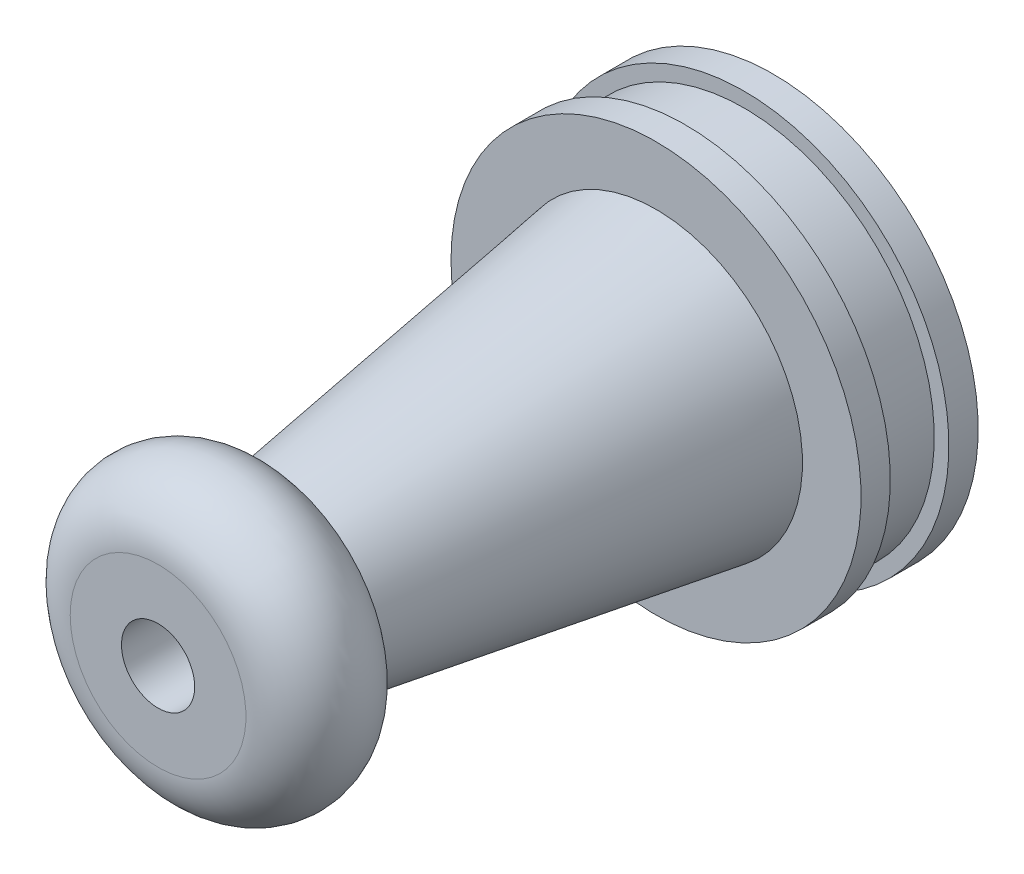
ISO-10303-21;
HEADER;
FILE_DESCRIPTION(('STEP AP214'),'2;1');
FILE_NAME('part.step','',(''),(''),'','','');
FILE_SCHEMA(('AUTOMOTIVE_DESIGN { 1 0 10303 214 1 1 1 1 }'));
ENDSEC;
DATA;
#1=APPLICATION_CONTEXT('core data for automotive mechanical design processes');
#2=APPLICATION_PROTOCOL_DEFINITION('international standard','automotive_design',2000,#1);
#3=PRODUCT_CONTEXT('',#1,'mechanical');
#4=PRODUCT('Part','Part','',(#3));
#5=PRODUCT_RELATED_PRODUCT_CATEGORY('part','',(#4));
#6=PRODUCT_DEFINITION_FORMATION('','',#4);
#7=PRODUCT_DEFINITION_CONTEXT('part definition',#1,'design');
#8=PRODUCT_DEFINITION('design','',#6,#7);
#9=PRODUCT_DEFINITION_SHAPE('','',#8);
#10=(LENGTH_UNIT() NAMED_UNIT(*) SI_UNIT(.MILLI.,.METRE.));
#11=(NAMED_UNIT(*) PLANE_ANGLE_UNIT() SI_UNIT($,.RADIAN.));
#12=(NAMED_UNIT(*) SI_UNIT($,.STERADIAN.) SOLID_ANGLE_UNIT());
#13=UNCERTAINTY_MEASURE_WITH_UNIT(LENGTH_MEASURE(1.E-05),#10,'distance_accuracy_value','');
#14=(GEOMETRIC_REPRESENTATION_CONTEXT(3) GLOBAL_UNCERTAINTY_ASSIGNED_CONTEXT((#13)) GLOBAL_UNIT_ASSIGNED_CONTEXT((#10,
#11,#12)) REPRESENTATION_CONTEXT('',''));
#15=CARTESIAN_POINT('',(0.,0.,0.));
#16=DIRECTION('',(0.,0.,1.));
#17=DIRECTION('',(1.,0.,0.));
#18=AXIS2_PLACEMENT_3D('',#15,#16,#17);
#19=CARTESIAN_POINT('',(0.,0.,-96.52));
#20=DIRECTION('',(0.,0.,1.));
#21=DIRECTION('',(1.,0.,0.));
#22=AXIS2_PLACEMENT_3D('',#19,#20,#21);
#23=CYLINDRICAL_SURFACE('',#22,35.56);
#24=CARTESIAN_POINT('',(0.,0.,-76.2));
#25=DIRECTION('',(0.,0.,-1.));
#26=DIRECTION('',(-1.,0.,0.));
#27=AXIS2_PLACEMENT_3D('',#24,#25,#26);
#28=CIRCLE('',#27,35.56);
#29=CARTESIAN_POINT('',(-35.56,0.,-76.2));
#30=VERTEX_POINT('',#29);
#31=EDGE_CURVE('E126',#30,#30,#28,.T.);
#32=ORIENTED_EDGE('',*,*,#31,.T.);
#33=EDGE_LOOP('',(#32));
#34=FACE_BOUND('',#33,.T.);
#35=CARTESIAN_POINT('',(0.,0.,-81.28));
#36=DIRECTION('',(0.,0.,-1.));
#37=DIRECTION('',(-1.,0.,0.));
#38=AXIS2_PLACEMENT_3D('',#35,#36,#37);
#39=CIRCLE('',#38,35.56);
#40=CARTESIAN_POINT('',(-35.56,0.,-81.28));
#41=VERTEX_POINT('',#40);
#42=EDGE_CURVE('E129',#41,#41,#39,.T.);
#43=ORIENTED_EDGE('',*,*,#42,.F.);
#44=EDGE_LOOP('',(#43));
#45=FACE_BOUND('',#44,.T.);
#46=ADVANCED_FACE('F51',(#34,#45),#23,.T.);
#47=CARTESIAN_POINT('',(0.,0.,10.16));
#48=DIRECTION('',(0.,0.,-1.));
#49=DIRECTION('',(-1.,0.,0.));
#50=AXIS2_PLACEMENT_3D('',#47,#48,#49);
#51=PLANE('',#50);
#52=CARTESIAN_POINT('',(0.,0.,10.16));
#53=DIRECTION('',(0.,0.,1.));
#54=DIRECTION('',(1.,0.,0.));
#55=AXIS2_PLACEMENT_3D('',#52,#53,#54);
#56=CIRCLE('',#55,6.35);
#57=CARTESIAN_POINT('',(6.35,0.,10.16));
#58=VERTEX_POINT('',#57);
#59=EDGE_CURVE('E150',#58,#58,#56,.T.);
#60=ORIENTED_EDGE('',*,*,#59,.F.);
#61=EDGE_LOOP('',(#60));
#62=FACE_BOUND('',#61,.T.);
#63=CARTESIAN_POINT('',(0.,0.,10.1600000000001));
#64=DIRECTION('',(0.,0.,-1.));
#65=DIRECTION('',(-1.,0.,0.));
#66=AXIS2_PLACEMENT_3D('',#63,#64,#65);
#67=CIRCLE('',#66,15.24);
#68=CARTESIAN_POINT('',(-15.2399999999999,0.,10.1600000000001));
#69=VERTEX_POINT('',#68);
#70=EDGE_CURVE('E60',#69,#69,#67,.T.);
#71=ORIENTED_EDGE('',*,*,#70,.F.);
#72=EDGE_LOOP('',(#71));
#73=FACE_BOUND('',#72,.T.);
#74=ADVANCED_FACE('F53',(#62,#73),#51,.F.);
#75=CARTESIAN_POINT('',(0.,0.,0.));
#76=DIRECTION('',(0.,0.,-1.));
#77=DIRECTION('',(-1.,0.,0.));
#78=AXIS2_PLACEMENT_3D('',#75,#76,#77);
#79=TOROIDAL_SURFACE('',#78,15.24,10.16);
#80=CARTESIAN_POINT('',(0.,0.,-10.16));
#81=DIRECTION('',(0.,0.,-1.));
#82=DIRECTION('',(-1.,0.,0.));
#83=AXIS2_PLACEMENT_3D('',#80,#81,#82);
#84=CIRCLE('',#83,15.24);
#85=CARTESIAN_POINT('',(-15.2400000000001,0.,-10.1599999999999));
#86=VERTEX_POINT('',#85);
#87=EDGE_CURVE('E11',#86,#86,#84,.T.);
#88=ORIENTED_EDGE('',*,*,#87,.F.);
#89=EDGE_LOOP('',(#88));
#90=FACE_BOUND('',#89,.T.);
#91=ORIENTED_EDGE('',*,*,#70,.T.);
#92=EDGE_LOOP('',(#91));
#93=FACE_BOUND('',#92,.T.);
#94=ADVANCED_FACE('F110',(#90,#93),#79,.T.);
#95=CARTESIAN_POINT('',(0.,0.,-10.16));
#96=DIRECTION('',(0.,0.,-1.));
#97=DIRECTION('',(-1.,0.,0.));
#98=AXIS2_PLACEMENT_3D('',#95,#96,#97);
#99=CONICAL_SURFACE('',#98,15.24,0.152649328395265);
#100=ORIENTED_EDGE('',*,*,#87,.T.);
#101=EDGE_LOOP('',(#100));
#102=FACE_BOUND('',#101,.T.);
#103=CARTESIAN_POINT('',(-2.96236303543775E-13,0.,-76.2));
#104=DIRECTION('',(0.,0.,-1.));
#105=DIRECTION('',(-1.,0.,0.));
#106=AXIS2_PLACEMENT_3D('',#103,#104,#105);
#107=CIRCLE('',#106,25.4);
#108=CARTESIAN_POINT('',(-25.4000000000003,0.,-76.1999999999999));
#109=VERTEX_POINT('',#108);
#110=EDGE_CURVE('E66',#109,#109,#107,.T.);
#111=ORIENTED_EDGE('',*,*,#110,.F.);
#112=EDGE_LOOP('',(#111));
#113=FACE_BOUND('',#112,.T.);
#114=ADVANCED_FACE('F103',(#102,#113),#99,.T.);
#115=CARTESIAN_POINT('',(0.,0.,-76.2));
#116=DIRECTION('',(0.,0.,-1.));
#117=DIRECTION('',(-1.,0.,0.));
#118=AXIS2_PLACEMENT_3D('',#115,#116,#117);
#119=PLANE('',#118);
#120=ORIENTED_EDGE('',*,*,#31,.F.);
#121=EDGE_LOOP('',(#120));
#122=FACE_BOUND('',#121,.T.);
#123=ORIENTED_EDGE('',*,*,#110,.T.);
#124=EDGE_LOOP('',(#123));
#125=FACE_BOUND('',#124,.T.);
#126=ADVANCED_FACE('F99',(#122,#125),#119,.F.);
#127=CARTESIAN_POINT('',(0.,0.,-81.28));
#128=DIRECTION('',(0.,0.,-1.));
#129=DIRECTION('',(-1.,0.,0.));
#130=AXIS2_PLACEMENT_3D('',#127,#128,#129);
#131=PLANE('',#130);
#132=CARTESIAN_POINT('',(0.,0.,-81.28));
#133=DIRECTION('',(0.,0.,-1.));
#134=DIRECTION('',(-1.,0.,0.));
#135=AXIS2_PLACEMENT_3D('',#132,#133,#134);
#136=CIRCLE('',#135,33.02);
#137=CARTESIAN_POINT('',(-33.02,0.,-81.28));
#138=VERTEX_POINT('',#137);
#139=EDGE_CURVE('E137',#138,#138,#136,.T.);
#140=ORIENTED_EDGE('',*,*,#139,.F.);
#141=EDGE_LOOP('',(#140));
#142=FACE_BOUND('',#141,.T.);
#143=ORIENTED_EDGE('',*,*,#42,.T.);
#144=EDGE_LOOP('',(#143));
#145=FACE_BOUND('',#144,.T.);
#146=ADVANCED_FACE('F102',(#142,#145),#131,.T.);
#147=CARTESIAN_POINT('',(0.,0.,-91.44));
#148=DIRECTION('',(0.,0.,-1.));
#149=DIRECTION('',(-1.,0.,0.));
#150=AXIS2_PLACEMENT_3D('',#147,#148,#149);
#151=PLANE('',#150);
#152=CARTESIAN_POINT('',(0.,0.,-91.44));
#153=DIRECTION('',(0.,0.,-1.));
#154=DIRECTION('',(-1.,0.,0.));
#155=AXIS2_PLACEMENT_3D('',#152,#153,#154);
#156=CIRCLE('',#155,33.02);
#157=CARTESIAN_POINT('',(-33.02,0.,-91.44));
#158=VERTEX_POINT('',#157);
#159=EDGE_CURVE('E140',#158,#158,#156,.T.);
#160=ORIENTED_EDGE('',*,*,#159,.T.);
#161=EDGE_LOOP('',(#160));
#162=FACE_BOUND('',#161,.T.);
#163=CARTESIAN_POINT('',(0.,0.,-91.44));
#164=DIRECTION('',(0.,0.,-1.));
#165=DIRECTION('',(-1.,0.,0.));
#166=AXIS2_PLACEMENT_3D('',#163,#164,#165);
#167=CIRCLE('',#166,35.56);
#168=CARTESIAN_POINT('',(-35.56,0.,-91.44));
#169=VERTEX_POINT('',#168);
#170=EDGE_CURVE('E132',#169,#169,#167,.T.);
#171=ORIENTED_EDGE('',*,*,#170,.F.);
#172=EDGE_LOOP('',(#171));
#173=FACE_BOUND('',#172,.T.);
#174=ADVANCED_FACE('F97',(#162,#173),#151,.F.);
#175=CARTESIAN_POINT('',(0.,0.,-81.28));
#176=DIRECTION('',(0.,0.,-1.));
#177=DIRECTION('',(-1.,0.,0.));
#178=AXIS2_PLACEMENT_3D('',#175,#176,#177);
#179=CYLINDRICAL_SURFACE('',#178,33.02);
#180=ORIENTED_EDGE('',*,*,#139,.T.);
#181=EDGE_LOOP('',(#180));
#182=FACE_BOUND('',#181,.T.);
#183=ORIENTED_EDGE('',*,*,#159,.F.);
#184=EDGE_LOOP('',(#183));
#185=FACE_BOUND('',#184,.T.);
#186=ADVANCED_FACE('F96',(#182,#185),#179,.T.);
#187=CARTESIAN_POINT('',(0.,0.,-96.52));
#188=DIRECTION('',(0.,0.,-1.));
#189=DIRECTION('',(-1.,0.,0.));
#190=AXIS2_PLACEMENT_3D('',#187,#188,#189);
#191=PLANE('',#190);
#192=CARTESIAN_POINT('',(0.,0.,-96.52));
#193=DIRECTION('',(0.,0.,-1.));
#194=DIRECTION('',(-1.,0.,0.));
#195=AXIS2_PLACEMENT_3D('',#192,#193,#194);
#196=CIRCLE('',#195,25.4);
#197=CARTESIAN_POINT('',(19.6319341564865,16.1166733935815,-96.52));
#198=VERTEX_POINT('',#197);
#199=EDGE_CURVE('E81',#198,#198,#196,.T.);
#200=ORIENTED_EDGE('',*,*,#199,.F.);
#201=EDGE_LOOP('',(#200));
#202=FACE_BOUND('',#201,.T.);
#203=CARTESIAN_POINT('',(0.,0.,-96.52));
#204=DIRECTION('',(0.,0.,-1.));
#205=DIRECTION('',(-1.,0.,0.));
#206=AXIS2_PLACEMENT_3D('',#203,#204,#205);
#207=CIRCLE('',#206,35.56);
#208=CARTESIAN_POINT('',(-35.56,0.,-96.52));
#209=VERTEX_POINT('',#208);
#210=EDGE_CURVE('E75',#209,#209,#207,.T.);
#211=ORIENTED_EDGE('',*,*,#210,.T.);
#212=EDGE_LOOP('',(#211));
#213=FACE_BOUND('',#212,.T.);
#214=ADVANCED_FACE('F85',(#202,#213),#191,.T.);
#215=ORIENTED_EDGE('',*,*,#170,.T.);
#216=EDGE_LOOP('',(#215));
#217=FACE_BOUND('',#216,.T.);
#218=ORIENTED_EDGE('',*,*,#210,.F.);
#219=EDGE_LOOP('',(#218));
#220=FACE_BOUND('',#219,.T.);
#221=ADVANCED_FACE('F95',(#217,#220),#23,.T.);
#222=CARTESIAN_POINT('',(0.,0.,-96.52));
#223=DIRECTION('',(0.,0.,1.));
#224=DIRECTION('',(1.,0.,0.));
#225=AXIS2_PLACEMENT_3D('',#222,#223,#224);
#226=CYLINDRICAL_SURFACE('',#225,6.35);
#227=ORIENTED_EDGE('',*,*,#59,.T.);
#228=EDGE_LOOP('',(#227));
#229=FACE_BOUND('',#228,.T.);
#230=CARTESIAN_POINT('',(0.,0.,-85.0160226953648));
#231=DIRECTION('',(0.,0.,1.));
#232=DIRECTION('',(0.,-1.,0.));
#233=AXIS2_PLACEMENT_3D('',#230,#231,#232);
#234=CIRCLE('',#233,6.35);
#235=CARTESIAN_POINT('',(2.82115907961658,5.68889808728342,-85.0160226953648));
#236=VERTEX_POINT('',#235);
#237=EDGE_CURVE('E55',#236,#236,#234,.T.);
#238=ORIENTED_EDGE('',*,*,#237,.F.);
#239=EDGE_LOOP('',(#238));
#240=FACE_BOUND('',#239,.T.);
#241=ADVANCED_FACE('F107',(#229,#240),#226,.F.);
#242=CARTESIAN_POINT('',(19.6319341564865,16.1166733935815,-96.52));
#243=CARTESIAN_POINT('',(-6.35,0.,-78.74));
#244=CARTESIAN_POINT('',(-12.6014126306765,55.3805417065545,-96.52));
#245=CARTESIAN_POINT('',(-6.35,-12.7,-78.74));
#246=CARTESIAN_POINT('',(-51.8652809436495,23.1471949193915,-96.52));
#247=CARTESIAN_POINT('',(6.35,-12.7,-78.74));
#248=CARTESIAN_POINT('',(-19.6319341564865,-16.1166733935815,-96.52));
#249=CARTESIAN_POINT('',(6.35,0.,-78.74));
#250=CARTESIAN_POINT('',(12.6014126306765,-55.3805417065545,-96.52));
#251=CARTESIAN_POINT('',(6.35,12.7,-78.74));
#252=CARTESIAN_POINT('',(51.8652809436495,-23.1471949193915,-96.52));
#253=CARTESIAN_POINT('',(-6.35,12.7,-78.74));
#254=CARTESIAN_POINT('',(19.6319341564865,16.1166733935815,-96.52));
#255=CARTESIAN_POINT('',(-6.35,0.,-78.74));
#256=(BOUNDED_SURFACE() B_SPLINE_SURFACE(3,1,((#242,#243),(#244,#245),(#246,#247),(#248,#249),
(#250,#251),(#252,#253),(#254,#255)),.UNSPECIFIED.,.T.,.F.,.F.) B_SPLINE_SURFACE_WITH_KNOTS((4,
3,4),(2,2),(0.,0.5,1.),(0.,1.),
.UNSPECIFIED.) GEOMETRIC_REPRESENTATION_ITEM() RATIONAL_B_SPLINE_SURFACE(((1.,1.),
(0.333333333333333,0.333333333333333),(0.333333333333333,0.333333333333333),(1.,1.),
(0.333333333333334,0.333333333333333),(0.333333333333334,0.333333333333333),(1.,1.))) REPRESENTATION_ITEM('') SURFACE());
#257=CARTESIAN_POINT('',(2.82115907961658,5.68889808728342,-85.0160226953648));
#258=CARTESIAN_POINT('',(2.99627132000064,5.79752074672403,-85.135855792288));
#259=CARTESIAN_POINT('',(3.1713835603847,5.90614340616463,-85.2556888892113));
#260=CARTESIAN_POINT('',(3.52160804115282,6.12338872504584,-85.4953550830579));
#261=CARTESIAN_POINT('',(3.69672028153689,6.23201138448645,-85.6151881799812));
#262=CARTESIAN_POINT('',(4.04694476230501,6.44925670336765,-85.8548543738277));
#263=CARTESIAN_POINT('',(4.22205700268907,6.55787936280826,-85.974687470751));
#264=CARTESIAN_POINT('',(4.5722814834572,6.77512468168947,-86.2143536645976));
#265=CARTESIAN_POINT('',(4.74739372384126,6.88374734113008,-86.3341867615209));
#266=CARTESIAN_POINT('',(5.09761820460938,7.10099266001129,-86.5738529553674));
#267=CARTESIAN_POINT('',(5.27273044499344,7.20961531945189,-86.6936860522907));
#268=CARTESIAN_POINT('',(5.62295492576157,7.4268606383331,-86.9333522461373));
#269=CARTESIAN_POINT('',(5.79806716614563,7.53548329777371,-87.0531853430606));
#270=CARTESIAN_POINT('',(6.14829164691375,7.75272861665492,-87.2928515369071));
#271=CARTESIAN_POINT('',(6.32340388729781,7.86135127609552,-87.4126846338304));
#272=CARTESIAN_POINT('',(6.67362836806594,8.07859659497673,-87.652350827677));
#273=CARTESIAN_POINT('',(6.84874060845,8.18721925441734,-87.7721839246003));
#274=CARTESIAN_POINT('',(7.19896508921813,8.40446457329855,-88.0118501184468));
#275=CARTESIAN_POINT('',(7.37407732960219,8.51308723273915,-88.1316832153701));
#276=CARTESIAN_POINT('',(7.72430181037031,8.73033255162036,-88.3713494092167));
#277=CARTESIAN_POINT('',(7.89941405075437,8.83895521106097,-88.49118250614));
#278=CARTESIAN_POINT('',(8.2496385315225,9.05620052994218,-88.7308486999865));
#279=CARTESIAN_POINT('',(8.42475077190656,9.16482318938278,-88.8506817969098));
#280=CARTESIAN_POINT('',(8.77497525267468,9.38206850826399,-89.0903479907564));
#281=CARTESIAN_POINT('',(8.95008749305874,9.4906911677046,-89.2101810876797));
#282=CARTESIAN_POINT('',(9.30031197382687,9.70793648658581,-89.4498472815262));
#283=CARTESIAN_POINT('',(9.47542421421093,9.81655914602641,-89.5696803784495));
#284=CARTESIAN_POINT('',(9.82564869497905,10.0338044649076,-89.8093465722961));
#285=CARTESIAN_POINT('',(10.0007609353631,10.1424271243482,-89.9291796692194));
#286=CARTESIAN_POINT('',(10.3509854161312,10.3596724432294,-90.1688458630659));
#287=CARTESIAN_POINT('',(10.5260976565153,10.46829510267,-90.2886789599892));
#288=CARTESIAN_POINT('',(10.8763221372834,10.6855404215513,-90.5283451538358));
#289=CARTESIAN_POINT('',(11.0514343776675,10.7941630809919,-90.6481782507591));
#290=CARTESIAN_POINT('',(11.4016588584356,11.0114083998731,-90.8878444446056));
#291=CARTESIAN_POINT('',(11.5767710988197,11.1200310593137,-91.0076775415289));
#292=CARTESIAN_POINT('',(11.9269955795878,11.3372763781949,-91.2473437353755));
#293=CARTESIAN_POINT('',(12.1021078199719,11.4458990376355,-91.3671768322988));
#294=CARTESIAN_POINT('',(12.45233230074,11.6631443565167,-91.6068430261453));
#295=CARTESIAN_POINT('',(12.627444541124,11.7717670159573,-91.7266761230686));
#296=CARTESIAN_POINT('',(12.9776690218922,11.9890123348385,-91.9663423169152));
#297=CARTESIAN_POINT('',(13.1527812622762,12.0976349942791,-92.0861754138385));
#298=CARTESIAN_POINT('',(13.5030057430443,12.3148803131603,-92.3258416076851));
#299=CARTESIAN_POINT('',(13.6781179834284,12.4235029726009,-92.4456747046083));
#300=CARTESIAN_POINT('',(14.0283424641965,12.6407482914821,-92.6853408984549));
#301=CARTESIAN_POINT('',(14.2034547045806,12.7493709509227,-92.8051739953782));
#302=CARTESIAN_POINT('',(14.5536791853487,12.966616269804,-93.0448401892247));
#303=CARTESIAN_POINT('',(14.7287914257328,13.0752389292446,-93.164673286148));
#304=CARTESIAN_POINT('',(15.0790159065009,13.2924842481258,-93.4043394799946));
#305=CARTESIAN_POINT('',(15.254128146885,13.4011069075664,-93.5241725769179));
#306=CARTESIAN_POINT('',(15.6043526276531,13.6183522264476,-93.7638387707644));
#307=CARTESIAN_POINT('',(15.7794648680372,13.7269748858882,-93.8836718676877));
#308=CARTESIAN_POINT('',(16.1296893488053,13.9442202047694,-94.1233380615343));
#309=CARTESIAN_POINT('',(16.3048015891893,14.05284286421,-94.2431711584576));
#310=CARTESIAN_POINT('',(16.6550260699575,14.2700881830912,-94.4828373523042));
#311=CARTESIAN_POINT('',(16.8301383103415,14.3787108425318,-94.6026704492274));
#312=CARTESIAN_POINT('',(17.1803627911097,14.595956161413,-94.842336643074));
#313=CARTESIAN_POINT('',(17.3554750314937,14.7045788208536,-94.9621697399973));
#314=CARTESIAN_POINT('',(17.7056995122618,14.9218241397349,-95.2018359338439));
#315=CARTESIAN_POINT('',(17.8808117526459,15.0304467991755,-95.3216690307671));
#316=CARTESIAN_POINT('',(18.231036233414,15.2476921180567,-95.5613352246137));
#317=CARTESIAN_POINT('',(18.4061484737981,15.3563147774973,-95.681168321537));
#318=CARTESIAN_POINT('',(18.7563729545662,15.5735600963785,-95.9208345153835));
#319=CARTESIAN_POINT('',(18.9314851949503,15.6821827558191,-96.0406676123068));
#320=CARTESIAN_POINT('',(19.2817096757184,15.8994280747003,-96.2803338061534));
#321=CARTESIAN_POINT('',(19.4568219161025,16.0080507341409,-96.4001669030767));
#322=CARTESIAN_POINT('',(19.6319341564865,16.1166733935815,-96.52));
#323=B_SPLINE_CURVE_WITH_KNOTS('',3,(#257,#258,#259,#260,#261,#262,#263,#264,#265,#266,#267,
#268,#269,#270,#271,#272,#273,#274,#275,#276,#277,#278,#279,#280,#281,#282,#283,#284,#285,#286,
#287,#288,#289,#290,#291,#292,#293,#294,#295,#296,#297,#298,#299,#300,#301,#302,#303,#304,#305,
#306,#307,#308,#309,#310,#311,#312,#313,#314,#315,#316,#317,#318,#319,#320,#321,#322),
.UNSPECIFIED.,.F.,.F.,(4,2,2,2,2,2,2,2,2,2,2,2,2,2,2,2,2,2,2,2,2,2,2,2,2,2,2,2,2,2,2,2,4),(0.,
0.71512820525448,1.43025641050897,2.14538461576345,2.86051282101794,3.57564102627243,
4.2907692315269,5.0058974367814,5.72102564203588,6.43615384729036,7.15128205254485,
7.86641025779934,8.58153846305382,9.29666666830831,10.0117948735628,10.7269230788173,
11.4420512840718,12.1571794893262,12.8723076945807,13.5874358998352,14.3025641050897,
15.0176923103442,15.7328205155987,16.4479487208532,17.1630769261076,17.8782051313621,
18.5933333366166,19.3084615418711,20.0235897471256,20.7387179523801,21.4538461576346,
22.168974362889,22.8841025681435),.UNSPECIFIED.);
#324=EDGE_CURVE('BSEAM165',#236,#198,#323,.T.);
#325=ORIENTED_EDGE('',*,*,#237,.T.);
#326=ORIENTED_EDGE('',*,*,#199,.T.);
#327=ORIENTED_EDGE('',*,*,#324,.T.);
#328=ORIENTED_EDGE('',*,*,#324,.F.);
#329=EDGE_LOOP('',(#325,#327,#326,#328));
#330=FACE_BOUND('',#329,.T.);
#331=ADVANCED_FACE('F165',(#330),#256,.F.);
#332=CLOSED_SHELL('',(#46,#74,#94,#114,#126,#146,#174,#186,#214,#221,#241,#331));
#333=MANIFOLD_SOLID_BREP('B2',#332);
#334=ADVANCED_BREP_SHAPE_REPRESENTATION('',(#18,#333),#14);
#335=SHAPE_DEFINITION_REPRESENTATION(#9,#334);
ENDSEC;
END-ISO-10303-21;
